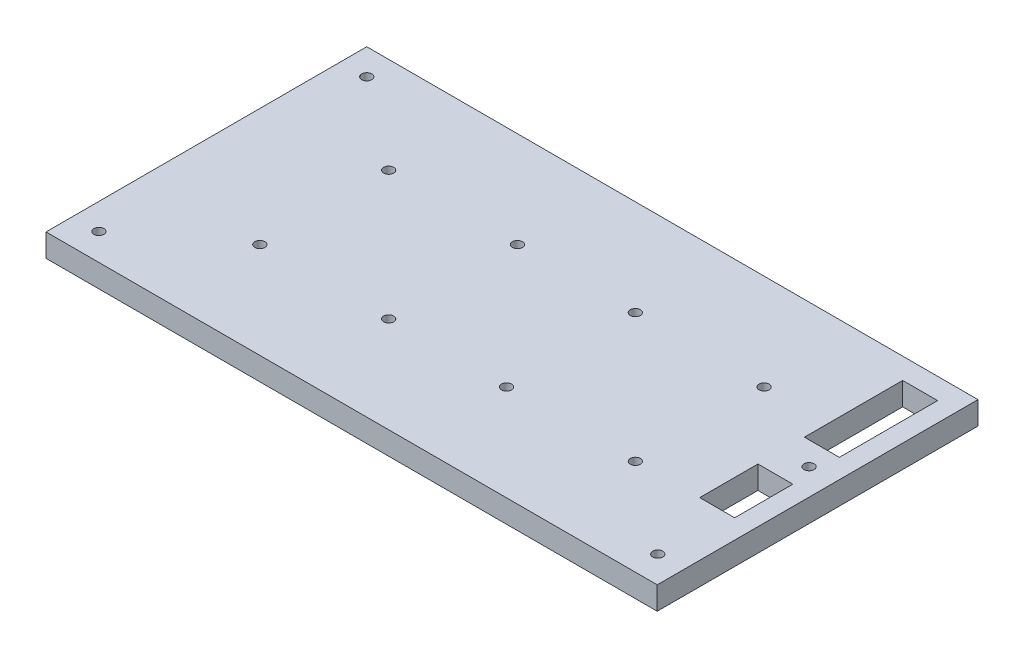
ISO-10303-21;
HEADER;
FILE_DESCRIPTION(('STEP AP214'),'2;1');
FILE_NAME('part.step','',(''),(''),'','','');
FILE_SCHEMA(('AUTOMOTIVE_DESIGN { 1 0 10303 214 1 1 1 1 }'));
ENDSEC;
DATA;
#1=APPLICATION_CONTEXT('core data for automotive mechanical design processes');
#2=APPLICATION_PROTOCOL_DEFINITION('international standard','automotive_design',2000,#1);
#3=PRODUCT_CONTEXT('',#1,'mechanical');
#4=PRODUCT('Part','Part','',(#3));
#5=PRODUCT_RELATED_PRODUCT_CATEGORY('part','',(#4));
#6=PRODUCT_DEFINITION_FORMATION('','',#4);
#7=PRODUCT_DEFINITION_CONTEXT('part definition',#1,'design');
#8=PRODUCT_DEFINITION('design','',#6,#7);
#9=PRODUCT_DEFINITION_SHAPE('','',#8);
#10=(LENGTH_UNIT() NAMED_UNIT(*) SI_UNIT(.MILLI.,.METRE.));
#11=(NAMED_UNIT(*) PLANE_ANGLE_UNIT() SI_UNIT($,.RADIAN.));
#12=(NAMED_UNIT(*) SI_UNIT($,.STERADIAN.) SOLID_ANGLE_UNIT());
#13=UNCERTAINTY_MEASURE_WITH_UNIT(LENGTH_MEASURE(1.E-05),#10,'distance_accuracy_value','');
#14=(GEOMETRIC_REPRESENTATION_CONTEXT(3) GLOBAL_UNCERTAINTY_ASSIGNED_CONTEXT((#13)) GLOBAL_UNIT_ASSIGNED_CONTEXT((#10,
#11,#12)) REPRESENTATION_CONTEXT('',''));
#15=CARTESIAN_POINT('',(0.,0.,0.));
#16=DIRECTION('',(0.,0.,1.));
#17=DIRECTION('',(1.,0.,0.));
#18=AXIS2_PLACEMENT_3D('',#15,#16,#17);
#19=CARTESIAN_POINT('',(-133.35,5.,0.));
#20=DIRECTION('',(0.,0.,-1.));
#21=DIRECTION('',(-1.,0.,0.));
#22=AXIS2_PLACEMENT_3D('',#19,#20,#21);
#23=PLANE('',#22);
#24=DIRECTION('',(1.,0.,0.));
#25=VECTOR('',#24,1.);
#26=CARTESIAN_POINT('',(-133.35,0.,0.));
#27=LINE('',#26,#25);
#28=CARTESIAN_POINT('',(-133.35,0.,0.));
#29=VERTEX_POINT('',#28);
#30=CARTESIAN_POINT('',(0.,0.,0.));
#31=VERTEX_POINT('',#30);
#32=EDGE_CURVE('E262',#29,#31,#27,.T.);
#33=ORIENTED_EDGE('',*,*,#32,.T.);
#34=DIRECTION('',(0.,-1.,0.));
#35=VECTOR('',#34,1.);
#36=CARTESIAN_POINT('',(0.,5.,0.));
#37=LINE('',#36,#35);
#38=CARTESIAN_POINT('',(0.,5.,0.));
#39=VERTEX_POINT('',#38);
#40=EDGE_CURVE('E11',#39,#31,#37,.T.);
#41=ORIENTED_EDGE('',*,*,#40,.F.);
#42=DIRECTION('',(1.,0.,0.));
#43=VECTOR('',#42,1.);
#44=CARTESIAN_POINT('',(-133.35,5.,0.));
#45=LINE('',#44,#43);
#46=CARTESIAN_POINT('',(-133.35,5.,0.));
#47=VERTEX_POINT('',#46);
#48=EDGE_CURVE('E265',#47,#39,#45,.T.);
#49=ORIENTED_EDGE('',*,*,#48,.F.);
#50=DIRECTION('',(0.,-1.,0.));
#51=VECTOR('',#50,1.);
#52=CARTESIAN_POINT('',(-133.35,5.,0.));
#53=LINE('',#52,#51);
#54=EDGE_CURVE('E275',#47,#29,#53,.T.);
#55=ORIENTED_EDGE('',*,*,#54,.T.);
#56=EDGE_LOOP('',(#33,#41,#49,#55));
#57=FACE_BOUND('',#56,.T.);
#58=ADVANCED_FACE('F35',(#57),#23,.F.);
#59=CARTESIAN_POINT('',(0.,5.,0.));
#60=DIRECTION('',(-1.,0.,0.));
#61=DIRECTION('',(0.,0.,1.));
#62=AXIS2_PLACEMENT_3D('',#59,#60,#61);
#63=PLANE('',#62);
#64=DIRECTION('',(0.,0.,-1.));
#65=VECTOR('',#64,1.);
#66=CARTESIAN_POINT('',(0.,0.,0.));
#67=LINE('',#66,#65);
#68=CARTESIAN_POINT('',(0.,0.,-69.98));
#69=VERTEX_POINT('',#68);
#70=EDGE_CURVE('E278',#31,#69,#67,.T.);
#71=ORIENTED_EDGE('',*,*,#70,.T.);
#72=DIRECTION('',(0.,-1.,0.));
#73=VECTOR('',#72,1.);
#74=CARTESIAN_POINT('',(0.,5.,-69.98));
#75=LINE('',#74,#73);
#76=CARTESIAN_POINT('',(0.,5.,-69.98));
#77=VERTEX_POINT('',#76);
#78=EDGE_CURVE('E42',#77,#69,#75,.T.);
#79=ORIENTED_EDGE('',*,*,#78,.F.);
#80=DIRECTION('',(0.,0.,-1.));
#81=VECTOR('',#80,1.);
#82=CARTESIAN_POINT('',(0.,5.,0.));
#83=LINE('',#82,#81);
#84=EDGE_CURVE('E268',#39,#77,#83,.T.);
#85=ORIENTED_EDGE('',*,*,#84,.F.);
#86=ORIENTED_EDGE('',*,*,#40,.T.);
#87=EDGE_LOOP('',(#71,#79,#85,#86));
#88=FACE_BOUND('',#87,.T.);
#89=ADVANCED_FACE('F307',(#88),#63,.F.);
#90=CARTESIAN_POINT('',(0.,5.,-69.98));
#91=DIRECTION('',(0.,0.,1.));
#92=DIRECTION('',(1.,0.,0.));
#93=AXIS2_PLACEMENT_3D('',#90,#91,#92);
#94=PLANE('',#93);
#95=DIRECTION('',(-1.,0.,0.));
#96=VECTOR('',#95,1.);
#97=CARTESIAN_POINT('',(0.,0.,-69.98));
#98=LINE('',#97,#96);
#99=CARTESIAN_POINT('',(-133.35,0.,-69.98));
#100=VERTEX_POINT('',#99);
#101=EDGE_CURVE('E280',#69,#100,#98,.T.);
#102=ORIENTED_EDGE('',*,*,#101,.T.);
#103=DIRECTION('',(0.,-1.,0.));
#104=VECTOR('',#103,1.);
#105=CARTESIAN_POINT('',(-133.35,5.,-69.98));
#106=LINE('',#105,#104);
#107=CARTESIAN_POINT('',(-133.35,5.,-69.98));
#108=VERTEX_POINT('',#107);
#109=EDGE_CURVE('E285',#108,#100,#106,.T.);
#110=ORIENTED_EDGE('',*,*,#109,.F.);
#111=DIRECTION('',(-1.,0.,0.));
#112=VECTOR('',#111,1.);
#113=CARTESIAN_POINT('',(0.,5.,-69.98));
#114=LINE('',#113,#112);
#115=EDGE_CURVE('E271',#77,#108,#114,.T.);
#116=ORIENTED_EDGE('',*,*,#115,.F.);
#117=ORIENTED_EDGE('',*,*,#78,.T.);
#118=EDGE_LOOP('',(#102,#110,#116,#117));
#119=FACE_BOUND('',#118,.T.);
#120=ADVANCED_FACE('F292',(#119),#94,.F.);
#121=CARTESIAN_POINT('',(-133.35,5.,-69.98));
#122=DIRECTION('',(1.,0.,0.));
#123=DIRECTION('',(0.,0.,-1.));
#124=AXIS2_PLACEMENT_3D('',#121,#122,#123);
#125=PLANE('',#124);
#126=DIRECTION('',(0.,0.,1.));
#127=VECTOR('',#126,1.);
#128=CARTESIAN_POINT('',(-133.35,0.,-69.98));
#129=LINE('',#128,#127);
#130=EDGE_CURVE('E269',#100,#29,#129,.T.);
#131=ORIENTED_EDGE('',*,*,#130,.T.);
#132=ORIENTED_EDGE('',*,*,#54,.F.);
#133=DIRECTION('',(0.,0.,1.));
#134=VECTOR('',#133,1.);
#135=CARTESIAN_POINT('',(-133.35,5.,-69.98));
#136=LINE('',#135,#134);
#137=EDGE_CURVE('E273',#108,#47,#136,.T.);
#138=ORIENTED_EDGE('',*,*,#137,.F.);
#139=ORIENTED_EDGE('',*,*,#109,.T.);
#140=EDGE_LOOP('',(#131,#132,#138,#139));
#141=FACE_BOUND('',#140,.T.);
#142=ADVANCED_FACE('F300',(#141),#125,.F.);
#143=CARTESIAN_POINT('',(0.,5.,0.));
#144=DIRECTION('',(0.,1.,0.));
#145=DIRECTION('',(0.,0.,1.));
#146=AXIS2_PLACEMENT_3D('',#143,#144,#145);
#147=PLANE('',#146);
#148=DIRECTION('',(1.,0.,0.));
#149=VECTOR('',#148,1.);
#150=CARTESIAN_POINT('',(-11.84,5.,-21.11));
#151=LINE('',#150,#149);
#152=CARTESIAN_POINT('',(-11.84,5.,-21.11));
#153=VERTEX_POINT('',#152);
#154=CARTESIAN_POINT('',(-4.22,5.,-21.11));
#155=VERTEX_POINT('',#154);
#156=EDGE_CURVE('E49',#153,#155,#151,.T.);
#157=ORIENTED_EDGE('',*,*,#156,.F.);
#158=DIRECTION('',(0.,0.,1.));
#159=VECTOR('',#158,1.);
#160=CARTESIAN_POINT('',(-11.84,5.,-33.81));
#161=LINE('',#160,#159);
#162=CARTESIAN_POINT('',(-11.84,5.,-33.81));
#163=VERTEX_POINT('',#162);
#164=EDGE_CURVE('E144',#163,#153,#161,.T.);
#165=ORIENTED_EDGE('',*,*,#164,.F.);
#166=DIRECTION('',(-1.,0.,0.));
#167=VECTOR('',#166,1.);
#168=CARTESIAN_POINT('',(-4.22,5.,-33.81));
#169=LINE('',#168,#167);
#170=CARTESIAN_POINT('',(-4.22,5.,-33.81));
#171=VERTEX_POINT('',#170);
#172=EDGE_CURVE('E147',#171,#163,#169,.T.);
#173=ORIENTED_EDGE('',*,*,#172,.F.);
#174=DIRECTION('',(0.,0.,-1.));
#175=VECTOR('',#174,1.);
#176=CARTESIAN_POINT('',(-4.22,5.,-21.11));
#177=LINE('',#176,#175);
#178=EDGE_CURVE('E153',#155,#171,#177,.T.);
#179=ORIENTED_EDGE('',*,*,#178,.F.);
#180=EDGE_LOOP('',(#157,#165,#173,#179));
#181=FACE_BOUND('',#180,.T.);
#182=DIRECTION('',(0.,0.,-1.));
#183=VECTOR('',#182,1.);
#184=CARTESIAN_POINT('',(-4.22,5.,-65.39));
#185=LINE('',#184,#183);
#186=CARTESIAN_POINT('',(-4.22,5.,-43.95));
#187=VERTEX_POINT('',#186);
#188=CARTESIAN_POINT('',(-4.22,5.,-65.39));
#189=VERTEX_POINT('',#188);
#190=EDGE_CURVE('E57',#187,#189,#185,.T.);
#191=ORIENTED_EDGE('',*,*,#190,.F.);
#192=DIRECTION('',(1.,0.,0.));
#193=VECTOR('',#192,1.);
#194=CARTESIAN_POINT('',(-4.22,5.,-43.95));
#195=LINE('',#194,#193);
#196=CARTESIAN_POINT('',(-11.84,5.,-43.95));
#197=VERTEX_POINT('',#196);
#198=EDGE_CURVE('E168',#197,#187,#195,.T.);
#199=ORIENTED_EDGE('',*,*,#198,.F.);
#200=DIRECTION('',(0.,0.,1.));
#201=VECTOR('',#200,1.);
#202=CARTESIAN_POINT('',(-11.84,5.,-43.95));
#203=LINE('',#202,#201);
#204=CARTESIAN_POINT('',(-11.84,5.,-65.39));
#205=VERTEX_POINT('',#204);
#206=EDGE_CURVE('E182',#205,#197,#203,.T.);
#207=ORIENTED_EDGE('',*,*,#206,.F.);
#208=DIRECTION('',(-1.,0.,0.));
#209=VECTOR('',#208,1.);
#210=CARTESIAN_POINT('',(-11.84,5.,-65.39));
#211=LINE('',#210,#209);
#212=EDGE_CURVE('E179',#189,#205,#211,.T.);
#213=ORIENTED_EDGE('',*,*,#212,.F.);
#214=EDGE_LOOP('',(#191,#199,#207,#213));
#215=FACE_BOUND('',#214,.T.);
#216=CARTESIAN_POINT('',(-79.5333333333333,5.,-49.04));
#217=DIRECTION('',(0.,1.,0.));
#218=DIRECTION('',(0.,0.,1.));
#219=AXIS2_PLACEMENT_3D('',#216,#217,#218);
#220=CIRCLE('',#219,1.10000000000001);
#221=CARTESIAN_POINT('',(-79.5333333333333,5.,-47.94));
#222=VERTEX_POINT('',#221);
#223=EDGE_CURVE('E202',#222,#222,#220,.T.);
#224=ORIENTED_EDGE('',*,*,#223,.F.);
#225=EDGE_LOOP('',(#224));
#226=FACE_BOUND('',#225,.T.);
#227=CARTESIAN_POINT('',(-53.8166666666667,5.,-20.94));
#228=DIRECTION('',(0.,1.,0.));
#229=DIRECTION('',(0.,0.,1.));
#230=AXIS2_PLACEMENT_3D('',#227,#228,#229);
#231=CIRCLE('',#230,1.10000000000001);
#232=CARTESIAN_POINT('',(-53.8166666666667,5.,-19.84));
#233=VERTEX_POINT('',#232);
#234=EDGE_CURVE('E215',#233,#233,#231,.T.);
#235=ORIENTED_EDGE('',*,*,#234,.F.);
#236=EDGE_LOOP('',(#235));
#237=FACE_BOUND('',#236,.T.);
#238=CARTESIAN_POINT('',(-53.8166666666667,5.,-49.04));
#239=DIRECTION('',(0.,1.,0.));
#240=DIRECTION('',(0.,0.,1.));
#241=AXIS2_PLACEMENT_3D('',#238,#239,#240);
#242=CIRCLE('',#241,1.10000000000001);
#243=CARTESIAN_POINT('',(-53.8166666666667,5.,-47.94));
#244=VERTEX_POINT('',#243);
#245=EDGE_CURVE('E214',#244,#244,#242,.T.);
#246=ORIENTED_EDGE('',*,*,#245,.F.);
#247=EDGE_LOOP('',(#246));
#248=FACE_BOUND('',#247,.T.);
#249=CARTESIAN_POINT('',(-25.7166666666667,5.,-20.94));
#250=DIRECTION('',(0.,1.,0.));
#251=DIRECTION('',(0.,0.,1.));
#252=AXIS2_PLACEMENT_3D('',#249,#250,#251);
#253=CIRCLE('',#252,1.10000000000001);
#254=CARTESIAN_POINT('',(-25.7166666666667,5.,-19.84));
#255=VERTEX_POINT('',#254);
#256=EDGE_CURVE('E227',#255,#255,#253,.T.);
#257=ORIENTED_EDGE('',*,*,#256,.F.);
#258=EDGE_LOOP('',(#257));
#259=FACE_BOUND('',#258,.T.);
#260=CARTESIAN_POINT('',(-107.633333333333,5.,-20.94));
#261=DIRECTION('',(0.,1.,0.));
#262=DIRECTION('',(0.,0.,1.));
#263=AXIS2_PLACEMENT_3D('',#260,#261,#262);
#264=CIRCLE('',#263,1.10000000000002);
#265=CARTESIAN_POINT('',(-107.633333333333,5.,-19.84));
#266=VERTEX_POINT('',#265);
#267=EDGE_CURVE('E160',#266,#266,#264,.T.);
#268=ORIENTED_EDGE('',*,*,#267,.F.);
#269=EDGE_LOOP('',(#268));
#270=FACE_BOUND('',#269,.T.);
#271=CARTESIAN_POINT('',(-107.633333333333,5.,-49.04));
#272=DIRECTION('',(0.,1.,0.));
#273=DIRECTION('',(0.,0.,1.));
#274=AXIS2_PLACEMENT_3D('',#271,#272,#273);
#275=CIRCLE('',#274,1.10000000000002);
#276=CARTESIAN_POINT('',(-107.633333333333,5.,-47.94));
#277=VERTEX_POINT('',#276);
#278=EDGE_CURVE('E196',#277,#277,#275,.T.);
#279=ORIENTED_EDGE('',*,*,#278,.F.);
#280=EDGE_LOOP('',(#279));
#281=FACE_BOUND('',#280,.T.);
#282=CARTESIAN_POINT('',(-79.5333333333333,5.,-20.94));
#283=DIRECTION('',(0.,1.,0.));
#284=DIRECTION('',(0.,0.,1.));
#285=AXIS2_PLACEMENT_3D('',#282,#283,#284);
#286=CIRCLE('',#285,1.10000000000001);
#287=CARTESIAN_POINT('',(-79.5333333333333,5.,-19.84));
#288=VERTEX_POINT('',#287);
#289=EDGE_CURVE('E203',#288,#288,#286,.T.);
#290=ORIENTED_EDGE('',*,*,#289,.F.);
#291=EDGE_LOOP('',(#290));
#292=FACE_BOUND('',#291,.T.);
#293=CARTESIAN_POINT('',(-25.7166666666667,5.,-49.04));
#294=DIRECTION('',(0.,1.,0.));
#295=DIRECTION('',(0.,0.,1.));
#296=AXIS2_PLACEMENT_3D('',#293,#294,#295);
#297=CIRCLE('',#296,1.10000000000001);
#298=CARTESIAN_POINT('',(-25.7166666666667,5.,-47.94));
#299=VERTEX_POINT('',#298);
#300=EDGE_CURVE('E226',#299,#299,#297,.T.);
#301=ORIENTED_EDGE('',*,*,#300,.F.);
#302=EDGE_LOOP('',(#301));
#303=FACE_BOUND('',#302,.T.);
#304=CARTESIAN_POINT('',(-127.67,5.,-64.29));
#305=DIRECTION('',(0.,1.,0.));
#306=DIRECTION('',(0.,0.,1.));
#307=AXIS2_PLACEMENT_3D('',#304,#305,#306);
#308=CIRCLE('',#307,1.10000000000002);
#309=CARTESIAN_POINT('',(-127.67,5.,-63.19));
#310=VERTEX_POINT('',#309);
#311=EDGE_CURVE('E238',#310,#310,#308,.T.);
#312=ORIENTED_EDGE('',*,*,#311,.F.);
#313=EDGE_LOOP('',(#312));
#314=FACE_BOUND('',#313,.T.);
#315=CARTESIAN_POINT('',(-127.67,5.,-5.86));
#316=DIRECTION('',(0.,1.,0.));
#317=DIRECTION('',(0.,0.,1.));
#318=AXIS2_PLACEMENT_3D('',#315,#316,#317);
#319=CIRCLE('',#318,1.10000000000002);
#320=CARTESIAN_POINT('',(-127.67,5.,-4.75999999999998));
#321=VERTEX_POINT('',#320);
#322=EDGE_CURVE('E251',#321,#321,#319,.T.);
#323=ORIENTED_EDGE('',*,*,#322,.F.);
#324=EDGE_LOOP('',(#323));
#325=FACE_BOUND('',#324,.T.);
#326=CARTESIAN_POINT('',(-5.75,5.,-5.86));
#327=DIRECTION('',(0.,1.,0.));
#328=DIRECTION('',(0.,0.,1.));
#329=AXIS2_PLACEMENT_3D('',#326,#327,#328);
#330=CIRCLE('',#329,1.1);
#331=CARTESIAN_POINT('',(-5.75,5.,-4.76));
#332=VERTEX_POINT('',#331);
#333=EDGE_CURVE('E245',#332,#332,#330,.T.);
#334=ORIENTED_EDGE('',*,*,#333,.F.);
#335=EDGE_LOOP('',(#334));
#336=FACE_BOUND('',#335,.T.);
#337=CARTESIAN_POINT('',(-5.75,5.,-38.88));
#338=DIRECTION('',(0.,1.,0.));
#339=DIRECTION('',(0.,0.,1.));
#340=AXIS2_PLACEMENT_3D('',#337,#338,#339);
#341=CIRCLE('',#340,1.1);
#342=CARTESIAN_POINT('',(-5.75,5.,-37.78));
#343=VERTEX_POINT('',#342);
#344=EDGE_CURVE('E244',#343,#343,#341,.T.);
#345=ORIENTED_EDGE('',*,*,#344,.F.);
#346=EDGE_LOOP('',(#345));
#347=FACE_BOUND('',#346,.T.);
#348=ORIENTED_EDGE('',*,*,#48,.T.);
#349=ORIENTED_EDGE('',*,*,#84,.T.);
#350=ORIENTED_EDGE('',*,*,#115,.T.);
#351=ORIENTED_EDGE('',*,*,#137,.T.);
#352=EDGE_LOOP('',(#348,#349,#350,#351));
#353=FACE_BOUND('',#352,.T.);
#354=ADVANCED_FACE('F306',(#181,#215,#226,#237,#248,#259,#270,#281,#292,#303,#314,#325,#336,
#347,#353),#147,.T.);
#355=CARTESIAN_POINT('',(0.,0.,0.));
#356=DIRECTION('',(0.,1.,0.));
#357=DIRECTION('',(0.,0.,1.));
#358=AXIS2_PLACEMENT_3D('',#355,#356,#357);
#359=PLANE('',#358);
#360=DIRECTION('',(0.,0.,1.));
#361=VECTOR('',#360,1.);
#362=CARTESIAN_POINT('',(-11.84,0.,-33.81));
#363=LINE('',#362,#361);
#364=CARTESIAN_POINT('',(-11.84,0.,-33.81));
#365=VERTEX_POINT('',#364);
#366=CARTESIAN_POINT('',(-11.84,0.,-21.11));
#367=VERTEX_POINT('',#366);
#368=EDGE_CURVE('E131',#365,#367,#363,.T.);
#369=ORIENTED_EDGE('',*,*,#368,.T.);
#370=DIRECTION('',(1.,0.,0.));
#371=VECTOR('',#370,1.);
#372=CARTESIAN_POINT('',(-11.84,0.,-21.11));
#373=LINE('',#372,#371);
#374=CARTESIAN_POINT('',(-4.22,0.,-21.11));
#375=VERTEX_POINT('',#374);
#376=EDGE_CURVE('E125',#367,#375,#373,.T.);
#377=ORIENTED_EDGE('',*,*,#376,.T.);
#378=DIRECTION('',(0.,0.,-1.));
#379=VECTOR('',#378,1.);
#380=CARTESIAN_POINT('',(-4.22,0.,-21.11));
#381=LINE('',#380,#379);
#382=CARTESIAN_POINT('',(-4.22,0.,-33.81));
#383=VERTEX_POINT('',#382);
#384=EDGE_CURVE('E135',#375,#383,#381,.T.);
#385=ORIENTED_EDGE('',*,*,#384,.T.);
#386=DIRECTION('',(-1.,0.,0.));
#387=VECTOR('',#386,1.);
#388=CARTESIAN_POINT('',(-4.22,0.,-33.81));
#389=LINE('',#388,#387);
#390=EDGE_CURVE('E139',#383,#365,#389,.T.);
#391=ORIENTED_EDGE('',*,*,#390,.T.);
#392=EDGE_LOOP('',(#369,#377,#385,#391));
#393=FACE_BOUND('',#392,.T.);
#394=DIRECTION('',(1.,0.,0.));
#395=VECTOR('',#394,1.);
#396=CARTESIAN_POINT('',(-4.22,0.,-43.95));
#397=LINE('',#396,#395);
#398=CARTESIAN_POINT('',(-11.84,0.,-43.95));
#399=VERTEX_POINT('',#398);
#400=CARTESIAN_POINT('',(-4.22,0.,-43.95));
#401=VERTEX_POINT('',#400);
#402=EDGE_CURVE('E174',#399,#401,#397,.T.);
#403=ORIENTED_EDGE('',*,*,#402,.T.);
#404=DIRECTION('',(0.,0.,-1.));
#405=VECTOR('',#404,1.);
#406=CARTESIAN_POINT('',(-4.22,0.,-65.39));
#407=LINE('',#406,#405);
#408=CARTESIAN_POINT('',(-4.22,0.,-65.39));
#409=VERTEX_POINT('',#408);
#410=EDGE_CURVE('E164',#401,#409,#407,.T.);
#411=ORIENTED_EDGE('',*,*,#410,.T.);
#412=DIRECTION('',(-1.,0.,0.));
#413=VECTOR('',#412,1.);
#414=CARTESIAN_POINT('',(-11.84,0.,-65.39));
#415=LINE('',#414,#413);
#416=CARTESIAN_POINT('',(-11.84,0.,-65.39));
#417=VERTEX_POINT('',#416);
#418=EDGE_CURVE('E167',#409,#417,#415,.T.);
#419=ORIENTED_EDGE('',*,*,#418,.T.);
#420=DIRECTION('',(0.,0.,1.));
#421=VECTOR('',#420,1.);
#422=CARTESIAN_POINT('',(-11.84,0.,-43.95));
#423=LINE('',#422,#421);
#424=EDGE_CURVE('E171',#417,#399,#423,.T.);
#425=ORIENTED_EDGE('',*,*,#424,.T.);
#426=EDGE_LOOP('',(#403,#411,#419,#425));
#427=FACE_BOUND('',#426,.T.);
#428=CARTESIAN_POINT('',(-79.5333333333333,0.,-49.04));
#429=DIRECTION('',(0.,1.,0.));
#430=DIRECTION('',(0.,0.,1.));
#431=AXIS2_PLACEMENT_3D('',#428,#429,#430);
#432=CIRCLE('',#431,1.10000000000001);
#433=CARTESIAN_POINT('',(-79.5333333333333,0.,-47.94));
#434=VERTEX_POINT('',#433);
#435=EDGE_CURVE('E218',#434,#434,#432,.T.);
#436=ORIENTED_EDGE('',*,*,#435,.T.);
#437=EDGE_LOOP('',(#436));
#438=FACE_BOUND('',#437,.T.);
#439=CARTESIAN_POINT('',(-53.8166666666667,0.,-20.94));
#440=DIRECTION('',(0.,1.,0.));
#441=DIRECTION('',(0.,0.,1.));
#442=AXIS2_PLACEMENT_3D('',#439,#440,#441);
#443=CIRCLE('',#442,1.10000000000001);
#444=CARTESIAN_POINT('',(-53.8166666666667,0.,-19.84));
#445=VERTEX_POINT('',#444);
#446=EDGE_CURVE('E211',#445,#445,#443,.T.);
#447=ORIENTED_EDGE('',*,*,#446,.T.);
#448=EDGE_LOOP('',(#447));
#449=FACE_BOUND('',#448,.T.);
#450=CARTESIAN_POINT('',(-53.8166666666667,0.,-49.04));
#451=DIRECTION('',(0.,1.,0.));
#452=DIRECTION('',(0.,0.,1.));
#453=AXIS2_PLACEMENT_3D('',#450,#451,#452);
#454=CIRCLE('',#453,1.10000000000001);
#455=CARTESIAN_POINT('',(-53.8166666666667,0.,-47.94));
#456=VERTEX_POINT('',#455);
#457=EDGE_CURVE('E230',#456,#456,#454,.T.);
#458=ORIENTED_EDGE('',*,*,#457,.T.);
#459=EDGE_LOOP('',(#458));
#460=FACE_BOUND('',#459,.T.);
#461=CARTESIAN_POINT('',(-25.7166666666667,0.,-20.94));
#462=DIRECTION('',(0.,1.,0.));
#463=DIRECTION('',(0.,0.,1.));
#464=AXIS2_PLACEMENT_3D('',#461,#462,#463);
#465=CIRCLE('',#464,1.10000000000001);
#466=CARTESIAN_POINT('',(-25.7166666666667,0.,-19.84));
#467=VERTEX_POINT('',#466);
#468=EDGE_CURVE('E223',#467,#467,#465,.T.);
#469=ORIENTED_EDGE('',*,*,#468,.T.);
#470=EDGE_LOOP('',(#469));
#471=FACE_BOUND('',#470,.T.);
#472=CARTESIAN_POINT('',(-107.633333333333,0.,-20.94));
#473=DIRECTION('',(0.,1.,0.));
#474=DIRECTION('',(0.,0.,1.));
#475=AXIS2_PLACEMENT_3D('',#472,#473,#474);
#476=CIRCLE('',#475,1.10000000000002);
#477=CARTESIAN_POINT('',(-107.633333333333,0.,-19.84));
#478=VERTEX_POINT('',#477);
#479=EDGE_CURVE('E193',#478,#478,#476,.T.);
#480=ORIENTED_EDGE('',*,*,#479,.T.);
#481=EDGE_LOOP('',(#480));
#482=FACE_BOUND('',#481,.T.);
#483=CARTESIAN_POINT('',(-107.633333333333,0.,-49.04));
#484=DIRECTION('',(0.,1.,0.));
#485=DIRECTION('',(0.,0.,1.));
#486=AXIS2_PLACEMENT_3D('',#483,#484,#485);
#487=CIRCLE('',#486,1.10000000000002);
#488=CARTESIAN_POINT('',(-107.633333333333,0.,-47.94));
#489=VERTEX_POINT('',#488);
#490=EDGE_CURVE('E206',#489,#489,#487,.T.);
#491=ORIENTED_EDGE('',*,*,#490,.T.);
#492=EDGE_LOOP('',(#491));
#493=FACE_BOUND('',#492,.T.);
#494=CARTESIAN_POINT('',(-79.5333333333333,0.,-20.94));
#495=DIRECTION('',(0.,1.,0.));
#496=DIRECTION('',(0.,0.,1.));
#497=AXIS2_PLACEMENT_3D('',#494,#495,#496);
#498=CIRCLE('',#497,1.10000000000001);
#499=CARTESIAN_POINT('',(-79.5333333333333,0.,-19.84));
#500=VERTEX_POINT('',#499);
#501=EDGE_CURVE('E199',#500,#500,#498,.T.);
#502=ORIENTED_EDGE('',*,*,#501,.T.);
#503=EDGE_LOOP('',(#502));
#504=FACE_BOUND('',#503,.T.);
#505=CARTESIAN_POINT('',(-25.7166666666667,0.,-49.04));
#506=DIRECTION('',(0.,1.,0.));
#507=DIRECTION('',(0.,0.,1.));
#508=AXIS2_PLACEMENT_3D('',#505,#506,#507);
#509=CIRCLE('',#508,1.10000000000001);
#510=CARTESIAN_POINT('',(-25.7166666666667,0.,-47.94));
#511=VERTEX_POINT('',#510);
#512=EDGE_CURVE('E235',#511,#511,#509,.T.);
#513=ORIENTED_EDGE('',*,*,#512,.T.);
#514=EDGE_LOOP('',(#513));
#515=FACE_BOUND('',#514,.T.);
#516=CARTESIAN_POINT('',(-127.67,0.,-64.29));
#517=DIRECTION('',(0.,1.,0.));
#518=DIRECTION('',(0.,0.,1.));
#519=AXIS2_PLACEMENT_3D('',#516,#517,#518);
#520=CIRCLE('',#519,1.10000000000002);
#521=CARTESIAN_POINT('',(-127.67,0.,-63.19));
#522=VERTEX_POINT('',#521);
#523=EDGE_CURVE('E254',#522,#522,#520,.T.);
#524=ORIENTED_EDGE('',*,*,#523,.T.);
#525=EDGE_LOOP('',(#524));
#526=FACE_BOUND('',#525,.T.);
#527=CARTESIAN_POINT('',(-127.67,0.,-5.86));
#528=DIRECTION('',(0.,1.,0.));
#529=DIRECTION('',(0.,0.,1.));
#530=AXIS2_PLACEMENT_3D('',#527,#528,#529);
#531=CIRCLE('',#530,1.10000000000002);
#532=CARTESIAN_POINT('',(-127.67,0.,-4.75999999999998));
#533=VERTEX_POINT('',#532);
#534=EDGE_CURVE('E248',#533,#533,#531,.T.);
#535=ORIENTED_EDGE('',*,*,#534,.T.);
#536=EDGE_LOOP('',(#535));
#537=FACE_BOUND('',#536,.T.);
#538=CARTESIAN_POINT('',(-5.75,0.,-5.86));
#539=DIRECTION('',(0.,1.,0.));
#540=DIRECTION('',(0.,0.,1.));
#541=AXIS2_PLACEMENT_3D('',#538,#539,#540);
#542=CIRCLE('',#541,1.1);
#543=CARTESIAN_POINT('',(-5.75,0.,-4.76));
#544=VERTEX_POINT('',#543);
#545=EDGE_CURVE('E241',#544,#544,#542,.T.);
#546=ORIENTED_EDGE('',*,*,#545,.T.);
#547=EDGE_LOOP('',(#546));
#548=FACE_BOUND('',#547,.T.);
#549=CARTESIAN_POINT('',(-5.75,0.,-38.88));
#550=DIRECTION('',(0.,1.,0.));
#551=DIRECTION('',(0.,0.,1.));
#552=AXIS2_PLACEMENT_3D('',#549,#550,#551);
#553=CIRCLE('',#552,1.1);
#554=CARTESIAN_POINT('',(-5.75,0.,-37.78));
#555=VERTEX_POINT('',#554);
#556=EDGE_CURVE('E259',#555,#555,#553,.T.);
#557=ORIENTED_EDGE('',*,*,#556,.T.);
#558=EDGE_LOOP('',(#557));
#559=FACE_BOUND('',#558,.T.);
#560=ORIENTED_EDGE('',*,*,#32,.F.);
#561=ORIENTED_EDGE('',*,*,#130,.F.);
#562=ORIENTED_EDGE('',*,*,#101,.F.);
#563=ORIENTED_EDGE('',*,*,#70,.F.);
#564=EDGE_LOOP('',(#560,#561,#562,#563));
#565=FACE_BOUND('',#564,.T.);
#566=ADVANCED_FACE('F141',(#393,#427,#438,#449,#460,#471,#482,#493,#504,#515,#526,#537,#548,
#559,#565),#359,.F.);
#567=CARTESIAN_POINT('',(-5.75,0.,-38.88));
#568=DIRECTION('',(0.,1.,0.));
#569=DIRECTION('',(0.,0.,1.));
#570=AXIS2_PLACEMENT_3D('',#567,#568,#569);
#571=CYLINDRICAL_SURFACE('',#570,1.1);
#572=ORIENTED_EDGE('',*,*,#556,.F.);
#573=EDGE_LOOP('',(#572));
#574=FACE_BOUND('',#573,.T.);
#575=ORIENTED_EDGE('',*,*,#344,.T.);
#576=EDGE_LOOP('',(#575));
#577=FACE_BOUND('',#576,.T.);
#578=ADVANCED_FACE('F319',(#574,#577),#571,.F.);
#579=CARTESIAN_POINT('',(-5.75,0.,-5.86));
#580=DIRECTION('',(0.,1.,0.));
#581=DIRECTION('',(0.,0.,1.));
#582=AXIS2_PLACEMENT_3D('',#579,#580,#581);
#583=CYLINDRICAL_SURFACE('',#582,1.1);
#584=ORIENTED_EDGE('',*,*,#545,.F.);
#585=EDGE_LOOP('',(#584));
#586=FACE_BOUND('',#585,.T.);
#587=ORIENTED_EDGE('',*,*,#333,.T.);
#588=EDGE_LOOP('',(#587));
#589=FACE_BOUND('',#588,.T.);
#590=ADVANCED_FACE('F325',(#586,#589),#583,.F.);
#591=CARTESIAN_POINT('',(-127.67,0.,-5.86));
#592=DIRECTION('',(0.,1.,0.));
#593=DIRECTION('',(0.,0.,1.));
#594=AXIS2_PLACEMENT_3D('',#591,#592,#593);
#595=CYLINDRICAL_SURFACE('',#594,1.10000000000002);
#596=ORIENTED_EDGE('',*,*,#534,.F.);
#597=EDGE_LOOP('',(#596));
#598=FACE_BOUND('',#597,.T.);
#599=ORIENTED_EDGE('',*,*,#322,.T.);
#600=EDGE_LOOP('',(#599));
#601=FACE_BOUND('',#600,.T.);
#602=ADVANCED_FACE('F331',(#598,#601),#595,.F.);
#603=CARTESIAN_POINT('',(-127.67,0.,-64.29));
#604=DIRECTION('',(0.,1.,0.));
#605=DIRECTION('',(0.,0.,1.));
#606=AXIS2_PLACEMENT_3D('',#603,#604,#605);
#607=CYLINDRICAL_SURFACE('',#606,1.10000000000002);
#608=ORIENTED_EDGE('',*,*,#523,.F.);
#609=EDGE_LOOP('',(#608));
#610=FACE_BOUND('',#609,.T.);
#611=ORIENTED_EDGE('',*,*,#311,.T.);
#612=EDGE_LOOP('',(#611));
#613=FACE_BOUND('',#612,.T.);
#614=ADVANCED_FACE('F327',(#610,#613),#607,.F.);
#615=CARTESIAN_POINT('',(-25.7166666666667,0.,-49.04));
#616=DIRECTION('',(0.,1.,0.));
#617=DIRECTION('',(0.,0.,1.));
#618=AXIS2_PLACEMENT_3D('',#615,#616,#617);
#619=CYLINDRICAL_SURFACE('',#618,1.10000000000001);
#620=ORIENTED_EDGE('',*,*,#512,.F.);
#621=EDGE_LOOP('',(#620));
#622=FACE_BOUND('',#621,.T.);
#623=ORIENTED_EDGE('',*,*,#300,.T.);
#624=EDGE_LOOP('',(#623));
#625=FACE_BOUND('',#624,.T.);
#626=ADVANCED_FACE('F330',(#622,#625),#619,.F.);
#627=CARTESIAN_POINT('',(-79.5333333333333,0.,-20.94));
#628=DIRECTION('',(0.,1.,0.));
#629=DIRECTION('',(0.,0.,1.));
#630=AXIS2_PLACEMENT_3D('',#627,#628,#629);
#631=CYLINDRICAL_SURFACE('',#630,1.10000000000001);
#632=ORIENTED_EDGE('',*,*,#501,.F.);
#633=EDGE_LOOP('',(#632));
#634=FACE_BOUND('',#633,.T.);
#635=ORIENTED_EDGE('',*,*,#289,.T.);
#636=EDGE_LOOP('',(#635));
#637=FACE_BOUND('',#636,.T.);
#638=ADVANCED_FACE('F341',(#634,#637),#631,.F.);
#639=CARTESIAN_POINT('',(-107.633333333333,0.,-49.04));
#640=DIRECTION('',(0.,1.,0.));
#641=DIRECTION('',(0.,0.,1.));
#642=AXIS2_PLACEMENT_3D('',#639,#640,#641);
#643=CYLINDRICAL_SURFACE('',#642,1.10000000000002);
#644=ORIENTED_EDGE('',*,*,#490,.F.);
#645=EDGE_LOOP('',(#644));
#646=FACE_BOUND('',#645,.T.);
#647=ORIENTED_EDGE('',*,*,#278,.T.);
#648=EDGE_LOOP('',(#647));
#649=FACE_BOUND('',#648,.T.);
#650=ADVANCED_FACE('F361',(#646,#649),#643,.F.);
#651=CARTESIAN_POINT('',(-107.633333333333,0.,-20.94));
#652=DIRECTION('',(0.,1.,0.));
#653=DIRECTION('',(0.,0.,1.));
#654=AXIS2_PLACEMENT_3D('',#651,#652,#653);
#655=CYLINDRICAL_SURFACE('',#654,1.10000000000002);
#656=ORIENTED_EDGE('',*,*,#479,.F.);
#657=EDGE_LOOP('',(#656));
#658=FACE_BOUND('',#657,.T.);
#659=ORIENTED_EDGE('',*,*,#267,.T.);
#660=EDGE_LOOP('',(#659));
#661=FACE_BOUND('',#660,.T.);
#662=ADVANCED_FACE('F351',(#658,#661),#655,.F.);
#663=CARTESIAN_POINT('',(-25.7166666666667,0.,-20.94));
#664=DIRECTION('',(0.,1.,0.));
#665=DIRECTION('',(0.,0.,1.));
#666=AXIS2_PLACEMENT_3D('',#663,#664,#665);
#667=CYLINDRICAL_SURFACE('',#666,1.10000000000001);
#668=ORIENTED_EDGE('',*,*,#468,.F.);
#669=EDGE_LOOP('',(#668));
#670=FACE_BOUND('',#669,.T.);
#671=ORIENTED_EDGE('',*,*,#256,.T.);
#672=EDGE_LOOP('',(#671));
#673=FACE_BOUND('',#672,.T.);
#674=ADVANCED_FACE('F347',(#670,#673),#667,.F.);
#675=CARTESIAN_POINT('',(-53.8166666666667,0.,-49.04));
#676=DIRECTION('',(0.,1.,0.));
#677=DIRECTION('',(0.,0.,1.));
#678=AXIS2_PLACEMENT_3D('',#675,#676,#677);
#679=CYLINDRICAL_SURFACE('',#678,1.10000000000001);
#680=ORIENTED_EDGE('',*,*,#457,.F.);
#681=EDGE_LOOP('',(#680));
#682=FACE_BOUND('',#681,.T.);
#683=ORIENTED_EDGE('',*,*,#245,.T.);
#684=EDGE_LOOP('',(#683));
#685=FACE_BOUND('',#684,.T.);
#686=ADVANCED_FACE('F343',(#682,#685),#679,.F.);
#687=CARTESIAN_POINT('',(-53.8166666666667,0.,-20.94));
#688=DIRECTION('',(0.,1.,0.));
#689=DIRECTION('',(0.,0.,1.));
#690=AXIS2_PLACEMENT_3D('',#687,#688,#689);
#691=CYLINDRICAL_SURFACE('',#690,1.10000000000001);
#692=ORIENTED_EDGE('',*,*,#446,.F.);
#693=EDGE_LOOP('',(#692));
#694=FACE_BOUND('',#693,.T.);
#695=ORIENTED_EDGE('',*,*,#234,.T.);
#696=EDGE_LOOP('',(#695));
#697=FACE_BOUND('',#696,.T.);
#698=ADVANCED_FACE('F346',(#694,#697),#691,.F.);
#699=CARTESIAN_POINT('',(-79.5333333333333,0.,-49.04));
#700=DIRECTION('',(0.,1.,0.));
#701=DIRECTION('',(0.,0.,1.));
#702=AXIS2_PLACEMENT_3D('',#699,#700,#701);
#703=CYLINDRICAL_SURFACE('',#702,1.10000000000001);
#704=ORIENTED_EDGE('',*,*,#435,.F.);
#705=EDGE_LOOP('',(#704));
#706=FACE_BOUND('',#705,.T.);
#707=ORIENTED_EDGE('',*,*,#223,.T.);
#708=EDGE_LOOP('',(#707));
#709=FACE_BOUND('',#708,.T.);
#710=ADVANCED_FACE('F353',(#706,#709),#703,.F.);
#711=CARTESIAN_POINT('',(-4.22,0.,-65.39));
#712=DIRECTION('',(1.,0.,0.));
#713=DIRECTION('',(0.,0.,-1.));
#714=AXIS2_PLACEMENT_3D('',#711,#712,#713);
#715=PLANE('',#714);
#716=ORIENTED_EDGE('',*,*,#190,.T.);
#717=DIRECTION('',(0.,1.,0.));
#718=VECTOR('',#717,1.);
#719=CARTESIAN_POINT('',(-4.22,0.,-65.39));
#720=LINE('',#719,#718);
#721=EDGE_CURVE('E177',#409,#189,#720,.T.);
#722=ORIENTED_EDGE('',*,*,#721,.F.);
#723=ORIENTED_EDGE('',*,*,#410,.F.);
#724=DIRECTION('',(0.,1.,0.));
#725=VECTOR('',#724,1.);
#726=CARTESIAN_POINT('',(-4.22,0.,-43.95));
#727=LINE('',#726,#725);
#728=EDGE_CURVE('E154',#401,#187,#727,.T.);
#729=ORIENTED_EDGE('',*,*,#728,.T.);
#730=EDGE_LOOP('',(#716,#722,#723,#729));
#731=FACE_BOUND('',#730,.T.);
#732=ADVANCED_FACE('F356',(#731),#715,.F.);
#733=CARTESIAN_POINT('',(-4.22,0.,-43.95));
#734=DIRECTION('',(0.,0.,1.));
#735=DIRECTION('',(1.,0.,0.));
#736=AXIS2_PLACEMENT_3D('',#733,#734,#735);
#737=PLANE('',#736);
#738=ORIENTED_EDGE('',*,*,#198,.T.);
#739=ORIENTED_EDGE('',*,*,#728,.F.);
#740=ORIENTED_EDGE('',*,*,#402,.F.);
#741=DIRECTION('',(0.,1.,0.));
#742=VECTOR('',#741,1.);
#743=CARTESIAN_POINT('',(-11.84,0.,-43.95));
#744=LINE('',#743,#742);
#745=EDGE_CURVE('E188',#399,#197,#744,.T.);
#746=ORIENTED_EDGE('',*,*,#745,.T.);
#747=EDGE_LOOP('',(#738,#739,#740,#746));
#748=FACE_BOUND('',#747,.T.);
#749=ADVANCED_FACE('F373',(#748),#737,.F.);
#750=CARTESIAN_POINT('',(-11.84,0.,-43.95));
#751=DIRECTION('',(-1.,0.,0.));
#752=DIRECTION('',(0.,0.,1.));
#753=AXIS2_PLACEMENT_3D('',#750,#751,#752);
#754=PLANE('',#753);
#755=ORIENTED_EDGE('',*,*,#206,.T.);
#756=ORIENTED_EDGE('',*,*,#745,.F.);
#757=ORIENTED_EDGE('',*,*,#424,.F.);
#758=DIRECTION('',(0.,1.,0.));
#759=VECTOR('',#758,1.);
#760=CARTESIAN_POINT('',(-11.84,0.,-65.39));
#761=LINE('',#760,#759);
#762=EDGE_CURVE('E190',#417,#205,#761,.T.);
#763=ORIENTED_EDGE('',*,*,#762,.T.);
#764=EDGE_LOOP('',(#755,#756,#757,#763));
#765=FACE_BOUND('',#764,.T.);
#766=ADVANCED_FACE('F377',(#765),#754,.F.);
#767=CARTESIAN_POINT('',(-11.84,0.,-65.39));
#768=DIRECTION('',(0.,0.,-1.));
#769=DIRECTION('',(-1.,0.,0.));
#770=AXIS2_PLACEMENT_3D('',#767,#768,#769);
#771=PLANE('',#770);
#772=ORIENTED_EDGE('',*,*,#212,.T.);
#773=ORIENTED_EDGE('',*,*,#762,.F.);
#774=ORIENTED_EDGE('',*,*,#418,.F.);
#775=ORIENTED_EDGE('',*,*,#721,.T.);
#776=EDGE_LOOP('',(#772,#773,#774,#775));
#777=FACE_BOUND('',#776,.T.);
#778=ADVANCED_FACE('F374',(#777),#771,.F.);
#779=CARTESIAN_POINT('',(-11.84,0.,-21.11));
#780=DIRECTION('',(0.,0.,1.));
#781=DIRECTION('',(1.,0.,0.));
#782=AXIS2_PLACEMENT_3D('',#779,#780,#781);
#783=PLANE('',#782);
#784=ORIENTED_EDGE('',*,*,#156,.T.);
#785=DIRECTION('',(0.,1.,0.));
#786=VECTOR('',#785,1.);
#787=CARTESIAN_POINT('',(-4.22,0.,-21.11));
#788=LINE('',#787,#786);
#789=EDGE_CURVE('E121',#375,#155,#788,.T.);
#790=ORIENTED_EDGE('',*,*,#789,.F.);
#791=ORIENTED_EDGE('',*,*,#376,.F.);
#792=DIRECTION('',(0.,1.,0.));
#793=VECTOR('',#792,1.);
#794=CARTESIAN_POINT('',(-11.84,0.,-21.11));
#795=LINE('',#794,#793);
#796=EDGE_CURVE('E158',#367,#153,#795,.T.);
#797=ORIENTED_EDGE('',*,*,#796,.T.);
#798=EDGE_LOOP('',(#784,#790,#791,#797));
#799=FACE_BOUND('',#798,.T.);
#800=ADVANCED_FACE('F123',(#799),#783,.F.);
#801=CARTESIAN_POINT('',(-11.84,0.,-33.81));
#802=DIRECTION('',(-1.,0.,0.));
#803=DIRECTION('',(0.,0.,1.));
#804=AXIS2_PLACEMENT_3D('',#801,#802,#803);
#805=PLANE('',#804);
#806=ORIENTED_EDGE('',*,*,#164,.T.);
#807=ORIENTED_EDGE('',*,*,#796,.F.);
#808=ORIENTED_EDGE('',*,*,#368,.F.);
#809=DIRECTION('',(0.,1.,0.));
#810=VECTOR('',#809,1.);
#811=CARTESIAN_POINT('',(-11.84,0.,-33.81));
#812=LINE('',#811,#810);
#813=EDGE_CURVE('E161',#365,#163,#812,.T.);
#814=ORIENTED_EDGE('',*,*,#813,.T.);
#815=EDGE_LOOP('',(#806,#807,#808,#814));
#816=FACE_BOUND('',#815,.T.);
#817=ADVANCED_FACE('F387',(#816),#805,.F.);
#818=CARTESIAN_POINT('',(-4.22,0.,-33.81));
#819=DIRECTION('',(0.,0.,-1.));
#820=DIRECTION('',(-1.,0.,0.));
#821=AXIS2_PLACEMENT_3D('',#818,#819,#820);
#822=PLANE('',#821);
#823=ORIENTED_EDGE('',*,*,#172,.T.);
#824=ORIENTED_EDGE('',*,*,#813,.F.);
#825=ORIENTED_EDGE('',*,*,#390,.F.);
#826=DIRECTION('',(0.,1.,0.));
#827=VECTOR('',#826,1.);
#828=CARTESIAN_POINT('',(-4.22,0.,-33.81));
#829=LINE('',#828,#827);
#830=EDGE_CURVE('E130',#383,#171,#829,.T.);
#831=ORIENTED_EDGE('',*,*,#830,.T.);
#832=EDGE_LOOP('',(#823,#824,#825,#831));
#833=FACE_BOUND('',#832,.T.);
#834=ADVANCED_FACE('F390',(#833),#822,.F.);
#835=CARTESIAN_POINT('',(-4.22,0.,-21.11));
#836=DIRECTION('',(1.,0.,0.));
#837=DIRECTION('',(0.,0.,-1.));
#838=AXIS2_PLACEMENT_3D('',#835,#836,#837);
#839=PLANE('',#838);
#840=ORIENTED_EDGE('',*,*,#178,.T.);
#841=ORIENTED_EDGE('',*,*,#830,.F.);
#842=ORIENTED_EDGE('',*,*,#384,.F.);
#843=ORIENTED_EDGE('',*,*,#789,.T.);
#844=EDGE_LOOP('',(#840,#841,#842,#843));
#845=FACE_BOUND('',#844,.T.);
#846=ADVANCED_FACE('F136',(#845),#839,.F.);
#847=CLOSED_SHELL('',(#58,#89,#120,#142,#354,#566,#578,#590,#602,#614,#626,#638,#650,#662,#674,
#686,#698,#710,#732,#749,#766,#778,#800,#817,#834,#846));
#848=MANIFOLD_SOLID_BREP('B2',#847);
#849=ADVANCED_BREP_SHAPE_REPRESENTATION('',(#18,#848),#14);
#850=SHAPE_DEFINITION_REPRESENTATION(#9,#849);
ENDSEC;
END-ISO-10303-21;
